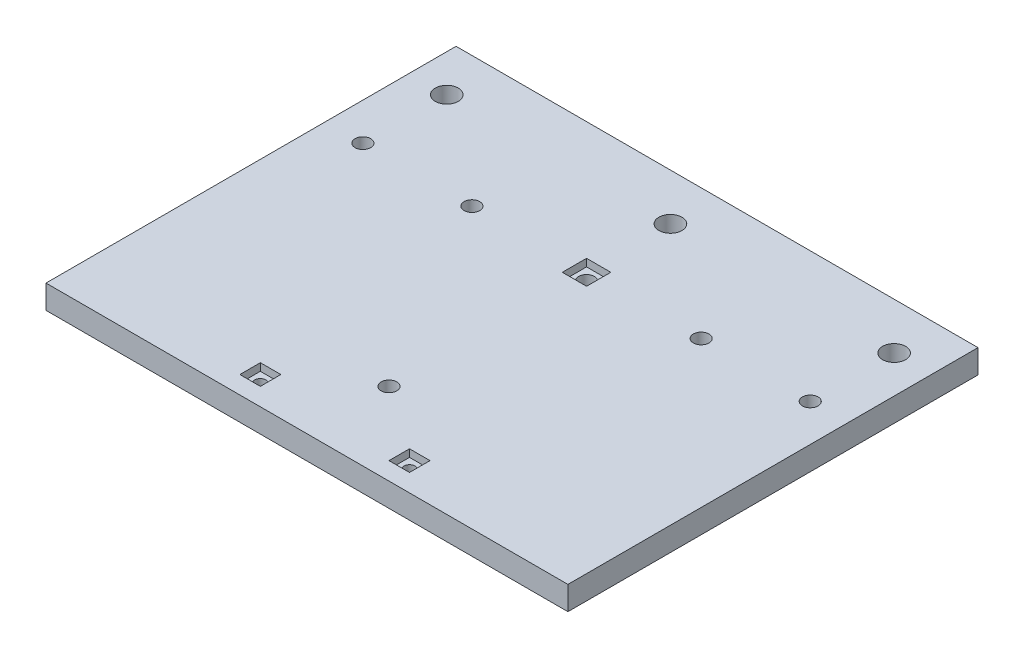
ISO-10303-21;
HEADER;
FILE_DESCRIPTION(('STEP AP214'),'2;1');
FILE_NAME('part.step','',(''),(''),'','','');
FILE_SCHEMA(('AUTOMOTIVE_DESIGN { 1 0 10303 214 1 1 1 1 }'));
ENDSEC;
DATA;
#1=APPLICATION_CONTEXT('core data for automotive mechanical design processes');
#2=APPLICATION_PROTOCOL_DEFINITION('international standard','automotive_design',2000,#1);
#3=PRODUCT_CONTEXT('',#1,'mechanical');
#4=PRODUCT('Part','Part','',(#3));
#5=PRODUCT_RELATED_PRODUCT_CATEGORY('part','',(#4));
#6=PRODUCT_DEFINITION_FORMATION('','',#4);
#7=PRODUCT_DEFINITION_CONTEXT('part definition',#1,'design');
#8=PRODUCT_DEFINITION('design','',#6,#7);
#9=PRODUCT_DEFINITION_SHAPE('','',#8);
#10=(LENGTH_UNIT() NAMED_UNIT(*) SI_UNIT(.MILLI.,.METRE.));
#11=(NAMED_UNIT(*) PLANE_ANGLE_UNIT() SI_UNIT($,.RADIAN.));
#12=(NAMED_UNIT(*) SI_UNIT($,.STERADIAN.) SOLID_ANGLE_UNIT());
#13=UNCERTAINTY_MEASURE_WITH_UNIT(LENGTH_MEASURE(1.E-05),#10,'distance_accuracy_value','');
#14=(GEOMETRIC_REPRESENTATION_CONTEXT(3) GLOBAL_UNCERTAINTY_ASSIGNED_CONTEXT((#13)) GLOBAL_UNIT_ASSIGNED_CONTEXT((#10,
#11,#12)) REPRESENTATION_CONTEXT('',''));
#15=CARTESIAN_POINT('',(0.,0.,0.));
#16=DIRECTION('',(0.,0.,1.));
#17=DIRECTION('',(1.,0.,0.));
#18=AXIS2_PLACEMENT_3D('',#15,#16,#17);
#19=CARTESIAN_POINT('',(0.,6.35,0.));
#20=DIRECTION('',(0.,0.,-1.));
#21=DIRECTION('',(-1.,0.,0.));
#22=AXIS2_PLACEMENT_3D('',#19,#20,#21);
#23=PLANE('',#22);
#24=DIRECTION('',(1.,0.,0.));
#25=VECTOR('',#24,1.);
#26=CARTESIAN_POINT('',(0.,0.,0.));
#27=LINE('',#26,#25);
#28=CARTESIAN_POINT('',(0.,0.,0.));
#29=VERTEX_POINT('',#28);
#30=CARTESIAN_POINT('',(140.,0.,0.));
#31=VERTEX_POINT('',#30);
#32=EDGE_CURVE('E387',#29,#31,#27,.T.);
#33=ORIENTED_EDGE('',*,*,#32,.T.);
#34=DIRECTION('',(0.,-1.,0.));
#35=VECTOR('',#34,1.);
#36=CARTESIAN_POINT('',(140.,6.35,0.));
#37=LINE('',#36,#35);
#38=CARTESIAN_POINT('',(140.,6.35,0.));
#39=VERTEX_POINT('',#38);
#40=EDGE_CURVE('E11',#39,#31,#37,.T.);
#41=ORIENTED_EDGE('',*,*,#40,.F.);
#42=DIRECTION('',(1.,0.,0.));
#43=VECTOR('',#42,1.);
#44=CARTESIAN_POINT('',(0.,6.35,0.));
#45=LINE('',#44,#43);
#46=CARTESIAN_POINT('',(0.,6.35,0.));
#47=VERTEX_POINT('',#46);
#48=EDGE_CURVE('E331',#47,#39,#45,.T.);
#49=ORIENTED_EDGE('',*,*,#48,.F.);
#50=DIRECTION('',(0.,-1.,0.));
#51=VECTOR('',#50,1.);
#52=CARTESIAN_POINT('',(0.,6.35,0.));
#53=LINE('',#52,#51);
#54=EDGE_CURVE('E346',#47,#29,#53,.T.);
#55=ORIENTED_EDGE('',*,*,#54,.T.);
#56=EDGE_LOOP('',(#33,#41,#49,#55));
#57=FACE_BOUND('',#56,.T.);
#58=ADVANCED_FACE('F45',(#57),#23,.F.);
#59=CARTESIAN_POINT('',(140.,6.35,0.));
#60=DIRECTION('',(-1.,0.,0.));
#61=DIRECTION('',(0.,0.,1.));
#62=AXIS2_PLACEMENT_3D('',#59,#60,#61);
#63=PLANE('',#62);
#64=DIRECTION('',(0.,0.,-1.));
#65=VECTOR('',#64,1.);
#66=CARTESIAN_POINT('',(140.,0.,0.));
#67=LINE('',#66,#65);
#68=CARTESIAN_POINT('',(140.,0.,-110.));
#69=VERTEX_POINT('',#68);
#70=EDGE_CURVE('E391',#31,#69,#67,.T.);
#71=ORIENTED_EDGE('',*,*,#70,.T.);
#72=DIRECTION('',(0.,-1.,0.));
#73=VECTOR('',#72,1.);
#74=CARTESIAN_POINT('',(140.,6.35,-110.));
#75=LINE('',#74,#73);
#76=CARTESIAN_POINT('',(140.,6.35,-110.));
#77=VERTEX_POINT('',#76);
#78=EDGE_CURVE('E55',#77,#69,#75,.T.);
#79=ORIENTED_EDGE('',*,*,#78,.F.);
#80=DIRECTION('',(0.,0.,-1.));
#81=VECTOR('',#80,1.);
#82=CARTESIAN_POINT('',(140.,6.35,0.));
#83=LINE('',#82,#81);
#84=EDGE_CURVE('E335',#39,#77,#83,.T.);
#85=ORIENTED_EDGE('',*,*,#84,.F.);
#86=ORIENTED_EDGE('',*,*,#40,.T.);
#87=EDGE_LOOP('',(#71,#79,#85,#86));
#88=FACE_BOUND('',#87,.T.);
#89=ADVANCED_FACE('F475',(#88),#63,.F.);
#90=CARTESIAN_POINT('',(0.,6.35,-110.));
#91=DIRECTION('',(0.,0.,-1.));
#92=DIRECTION('',(-1.,0.,0.));
#93=AXIS2_PLACEMENT_3D('',#90,#91,#92);
#94=PLANE('',#93);
#95=DIRECTION('',(1.,0.,0.));
#96=VECTOR('',#95,1.);
#97=CARTESIAN_POINT('',(0.,0.,-110.));
#98=LINE('',#97,#96);
#99=CARTESIAN_POINT('',(0.,0.,-110.));
#100=VERTEX_POINT('',#99);
#101=EDGE_CURVE('E395',#100,#69,#98,.T.);
#102=ORIENTED_EDGE('',*,*,#101,.F.);
#103=DIRECTION('',(0.,-1.,0.));
#104=VECTOR('',#103,1.);
#105=CARTESIAN_POINT('',(0.,6.35,-110.));
#106=LINE('',#105,#104);
#107=CARTESIAN_POINT('',(0.,6.35,-110.));
#108=VERTEX_POINT('',#107);
#109=EDGE_CURVE('E408',#108,#100,#106,.T.);
#110=ORIENTED_EDGE('',*,*,#109,.F.);
#111=DIRECTION('',(1.,0.,0.));
#112=VECTOR('',#111,1.);
#113=CARTESIAN_POINT('',(0.,6.35,-110.));
#114=LINE('',#113,#112);
#115=EDGE_CURVE('E338',#108,#77,#114,.T.);
#116=ORIENTED_EDGE('',*,*,#115,.T.);
#117=ORIENTED_EDGE('',*,*,#78,.T.);
#118=EDGE_LOOP('',(#102,#110,#116,#117));
#119=FACE_BOUND('',#118,.T.);
#120=ADVANCED_FACE('F481',(#119),#94,.T.);
#121=CARTESIAN_POINT('',(0.,6.35,0.));
#122=DIRECTION('',(-1.,0.,0.));
#123=DIRECTION('',(0.,0.,1.));
#124=AXIS2_PLACEMENT_3D('',#121,#122,#123);
#125=PLANE('',#124);
#126=DIRECTION('',(0.,0.,-1.));
#127=VECTOR('',#126,1.);
#128=CARTESIAN_POINT('',(0.,0.,0.));
#129=LINE('',#128,#127);
#130=EDGE_CURVE('E399',#29,#100,#129,.T.);
#131=ORIENTED_EDGE('',*,*,#130,.F.);
#132=ORIENTED_EDGE('',*,*,#54,.F.);
#133=DIRECTION('',(0.,0.,-1.));
#134=VECTOR('',#133,1.);
#135=CARTESIAN_POINT('',(0.,6.35,0.));
#136=LINE('',#135,#134);
#137=EDGE_CURVE('E342',#47,#108,#136,.T.);
#138=ORIENTED_EDGE('',*,*,#137,.T.);
#139=ORIENTED_EDGE('',*,*,#109,.T.);
#140=EDGE_LOOP('',(#131,#132,#138,#139));
#141=FACE_BOUND('',#140,.T.);
#142=ADVANCED_FACE('F490',(#141),#125,.T.);
#143=CARTESIAN_POINT('',(39.25,6.35,-75.));
#144=DIRECTION('',(0.,-1.,0.));
#145=DIRECTION('',(0.,0.,-1.));
#146=AXIS2_PLACEMENT_3D('',#143,#144,#145);
#147=CYLINDRICAL_SURFACE('',#146,2.10000000000001);
#148=CARTESIAN_POINT('',(39.25,6.35,-75.));
#149=DIRECTION('',(0.,1.,0.));
#150=DIRECTION('',(0.,0.,1.));
#151=AXIS2_PLACEMENT_3D('',#148,#149,#150);
#152=CIRCLE('',#151,2.10000000000001);
#153=CARTESIAN_POINT('',(39.25,6.35,-72.9));
#154=VERTEX_POINT('',#153);
#155=EDGE_CURVE('E327',#154,#154,#152,.T.);
#156=ORIENTED_EDGE('',*,*,#155,.T.);
#157=EDGE_LOOP('',(#156));
#158=FACE_BOUND('',#157,.T.);
#159=CARTESIAN_POINT('',(39.25,0.,-75.));
#160=DIRECTION('',(0.,1.,0.));
#161=DIRECTION('',(0.,0.,1.));
#162=AXIS2_PLACEMENT_3D('',#159,#160,#161);
#163=CIRCLE('',#162,2.10000000000001);
#164=CARTESIAN_POINT('',(39.25,0.,-72.9));
#165=VERTEX_POINT('',#164);
#166=EDGE_CURVE('E383',#165,#165,#163,.T.);
#167=ORIENTED_EDGE('',*,*,#166,.F.);
#168=EDGE_LOOP('',(#167));
#169=FACE_BOUND('',#168,.T.);
#170=ADVANCED_FACE('F486',(#158,#169),#147,.F.);
#171=CARTESIAN_POINT('',(100.75,6.35,-75.));
#172=DIRECTION('',(0.,-1.,0.));
#173=DIRECTION('',(0.,0.,-1.));
#174=AXIS2_PLACEMENT_3D('',#171,#172,#173);
#175=CYLINDRICAL_SURFACE('',#174,2.1);
#176=CARTESIAN_POINT('',(100.75,6.35,-75.));
#177=DIRECTION('',(0.,1.,0.));
#178=DIRECTION('',(0.,0.,1.));
#179=AXIS2_PLACEMENT_3D('',#176,#177,#178);
#180=CIRCLE('',#179,2.1);
#181=CARTESIAN_POINT('',(100.75,6.35,-72.9));
#182=VERTEX_POINT('',#181);
#183=EDGE_CURVE('E323',#182,#182,#180,.T.);
#184=ORIENTED_EDGE('',*,*,#183,.T.);
#185=EDGE_LOOP('',(#184));
#186=FACE_BOUND('',#185,.T.);
#187=CARTESIAN_POINT('',(100.75,0.,-75.));
#188=DIRECTION('',(0.,1.,0.));
#189=DIRECTION('',(0.,0.,1.));
#190=AXIS2_PLACEMENT_3D('',#187,#188,#189);
#191=CIRCLE('',#190,2.1);
#192=CARTESIAN_POINT('',(100.75,0.,-72.9));
#193=VERTEX_POINT('',#192);
#194=EDGE_CURVE('E379',#193,#193,#191,.T.);
#195=ORIENTED_EDGE('',*,*,#194,.F.);
#196=EDGE_LOOP('',(#195));
#197=FACE_BOUND('',#196,.T.);
#198=ADVANCED_FACE('F489',(#186,#197),#175,.F.);
#199=CARTESIAN_POINT('',(70.,6.35,-22.));
#200=DIRECTION('',(0.,-1.,0.));
#201=DIRECTION('',(0.,0.,-1.));
#202=AXIS2_PLACEMENT_3D('',#199,#200,#201);
#203=CYLINDRICAL_SURFACE('',#202,2.1);
#204=CARTESIAN_POINT('',(70.,6.35,-22.));
#205=DIRECTION('',(0.,1.,0.));
#206=DIRECTION('',(0.,0.,1.));
#207=AXIS2_PLACEMENT_3D('',#204,#205,#206);
#208=CIRCLE('',#207,2.1);
#209=CARTESIAN_POINT('',(70.,6.35,-19.9));
#210=VERTEX_POINT('',#209);
#211=EDGE_CURVE('E319',#210,#210,#208,.T.);
#212=ORIENTED_EDGE('',*,*,#211,.T.);
#213=EDGE_LOOP('',(#212));
#214=FACE_BOUND('',#213,.T.);
#215=CARTESIAN_POINT('',(70.,0.,-22.));
#216=DIRECTION('',(0.,1.,0.));
#217=DIRECTION('',(0.,0.,1.));
#218=AXIS2_PLACEMENT_3D('',#215,#216,#217);
#219=CIRCLE('',#218,2.1);
#220=CARTESIAN_POINT('',(70.,0.,-19.9));
#221=VERTEX_POINT('',#220);
#222=EDGE_CURVE('E375',#221,#221,#219,.T.);
#223=ORIENTED_EDGE('',*,*,#222,.F.);
#224=EDGE_LOOP('',(#223));
#225=FACE_BOUND('',#224,.T.);
#226=ADVANCED_FACE('F494',(#214,#225),#203,.F.);
#227=CARTESIAN_POINT('',(10.,6.35,-97.5));
#228=DIRECTION('',(0.,-1.,0.));
#229=DIRECTION('',(0.,0.,-1.));
#230=AXIS2_PLACEMENT_3D('',#227,#228,#229);
#231=CYLINDRICAL_SURFACE('',#230,3.1);
#232=CARTESIAN_POINT('',(10.,6.35,-97.5));
#233=DIRECTION('',(0.,1.,0.));
#234=DIRECTION('',(0.,0.,1.));
#235=AXIS2_PLACEMENT_3D('',#232,#233,#234);
#236=CIRCLE('',#235,3.1);
#237=CARTESIAN_POINT('',(10.,6.35,-94.4));
#238=VERTEX_POINT('',#237);
#239=EDGE_CURVE('E315',#238,#238,#236,.T.);
#240=ORIENTED_EDGE('',*,*,#239,.T.);
#241=EDGE_LOOP('',(#240));
#242=FACE_BOUND('',#241,.T.);
#243=CARTESIAN_POINT('',(10.,0.,-97.5));
#244=DIRECTION('',(0.,1.,0.));
#245=DIRECTION('',(0.,0.,1.));
#246=AXIS2_PLACEMENT_3D('',#243,#244,#245);
#247=CIRCLE('',#246,3.1);
#248=CARTESIAN_POINT('',(10.,0.,-94.4));
#249=VERTEX_POINT('',#248);
#250=EDGE_CURVE('E371',#249,#249,#247,.T.);
#251=ORIENTED_EDGE('',*,*,#250,.F.);
#252=EDGE_LOOP('',(#251));
#253=FACE_BOUND('',#252,.T.);
#254=ADVANCED_FACE('F498',(#242,#253),#231,.F.);
#255=CARTESIAN_POINT('',(70.,6.35,-97.5));
#256=DIRECTION('',(0.,-1.,0.));
#257=DIRECTION('',(0.,0.,-1.));
#258=AXIS2_PLACEMENT_3D('',#255,#256,#257);
#259=CYLINDRICAL_SURFACE('',#258,3.09999999999999);
#260=CARTESIAN_POINT('',(70.,6.35,-97.5));
#261=DIRECTION('',(0.,1.,0.));
#262=DIRECTION('',(0.,0.,1.));
#263=AXIS2_PLACEMENT_3D('',#260,#261,#262);
#264=CIRCLE('',#263,3.09999999999999);
#265=CARTESIAN_POINT('',(70.,6.35,-94.4));
#266=VERTEX_POINT('',#265);
#267=EDGE_CURVE('E311',#266,#266,#264,.T.);
#268=ORIENTED_EDGE('',*,*,#267,.T.);
#269=EDGE_LOOP('',(#268));
#270=FACE_BOUND('',#269,.T.);
#271=CARTESIAN_POINT('',(70.,0.,-97.5));
#272=DIRECTION('',(0.,1.,0.));
#273=DIRECTION('',(0.,0.,1.));
#274=AXIS2_PLACEMENT_3D('',#271,#272,#273);
#275=CIRCLE('',#274,3.09999999999999);
#276=CARTESIAN_POINT('',(70.,0.,-94.4));
#277=VERTEX_POINT('',#276);
#278=EDGE_CURVE('E367',#277,#277,#275,.T.);
#279=ORIENTED_EDGE('',*,*,#278,.F.);
#280=EDGE_LOOP('',(#279));
#281=FACE_BOUND('',#280,.T.);
#282=ADVANCED_FACE('F502',(#270,#281),#259,.F.);
#283=CARTESIAN_POINT('',(130.,6.35,-97.5));
#284=DIRECTION('',(0.,-1.,0.));
#285=DIRECTION('',(0.,0.,-1.));
#286=AXIS2_PLACEMENT_3D('',#283,#284,#285);
#287=CYLINDRICAL_SURFACE('',#286,3.09999999999999);
#288=CARTESIAN_POINT('',(130.,6.35,-97.5));
#289=DIRECTION('',(0.,1.,0.));
#290=DIRECTION('',(0.,0.,1.));
#291=AXIS2_PLACEMENT_3D('',#288,#289,#290);
#292=CIRCLE('',#291,3.09999999999999);
#293=CARTESIAN_POINT('',(130.,6.35,-94.4));
#294=VERTEX_POINT('',#293);
#295=EDGE_CURVE('E307',#294,#294,#292,.T.);
#296=ORIENTED_EDGE('',*,*,#295,.T.);
#297=EDGE_LOOP('',(#296));
#298=FACE_BOUND('',#297,.T.);
#299=CARTESIAN_POINT('',(130.,0.,-97.5));
#300=DIRECTION('',(0.,1.,0.));
#301=DIRECTION('',(0.,0.,1.));
#302=AXIS2_PLACEMENT_3D('',#299,#300,#301);
#303=CIRCLE('',#302,3.09999999999999);
#304=CARTESIAN_POINT('',(130.,0.,-94.4));
#305=VERTEX_POINT('',#304);
#306=EDGE_CURVE('E363',#305,#305,#303,.T.);
#307=ORIENTED_EDGE('',*,*,#306,.F.);
#308=EDGE_LOOP('',(#307));
#309=FACE_BOUND('',#308,.T.);
#310=ADVANCED_FACE('F506',(#298,#309),#287,.F.);
#311=CARTESIAN_POINT('',(10.,6.35,-75.));
#312=DIRECTION('',(0.,-1.,0.));
#313=DIRECTION('',(0.,0.,-1.));
#314=AXIS2_PLACEMENT_3D('',#311,#312,#313);
#315=CYLINDRICAL_SURFACE('',#314,2.1);
#316=CARTESIAN_POINT('',(10.,6.35,-75.));
#317=DIRECTION('',(0.,1.,0.));
#318=DIRECTION('',(0.,0.,1.));
#319=AXIS2_PLACEMENT_3D('',#316,#317,#318);
#320=CIRCLE('',#319,2.1);
#321=CARTESIAN_POINT('',(10.,6.35,-72.9));
#322=VERTEX_POINT('',#321);
#323=EDGE_CURVE('E302',#322,#322,#320,.T.);
#324=ORIENTED_EDGE('',*,*,#323,.T.);
#325=EDGE_LOOP('',(#324));
#326=FACE_BOUND('',#325,.T.);
#327=CARTESIAN_POINT('',(10.,0.,-75.));
#328=DIRECTION('',(0.,1.,0.));
#329=DIRECTION('',(0.,0.,1.));
#330=AXIS2_PLACEMENT_3D('',#327,#328,#329);
#331=CIRCLE('',#330,2.1);
#332=CARTESIAN_POINT('',(10.,0.,-72.9));
#333=VERTEX_POINT('',#332);
#334=EDGE_CURVE('E359',#333,#333,#331,.T.);
#335=ORIENTED_EDGE('',*,*,#334,.F.);
#336=EDGE_LOOP('',(#335));
#337=FACE_BOUND('',#336,.T.);
#338=ADVANCED_FACE('F510',(#326,#337),#315,.F.);
#339=CARTESIAN_POINT('',(130.,6.35,-75.));
#340=DIRECTION('',(0.,-1.,0.));
#341=DIRECTION('',(0.,0.,-1.));
#342=AXIS2_PLACEMENT_3D('',#339,#340,#341);
#343=CYLINDRICAL_SURFACE('',#342,2.10000000000002);
#344=CARTESIAN_POINT('',(130.,6.35,-75.));
#345=DIRECTION('',(0.,1.,0.));
#346=DIRECTION('',(0.,0.,1.));
#347=AXIS2_PLACEMENT_3D('',#344,#345,#346);
#348=CIRCLE('',#347,2.10000000000002);
#349=CARTESIAN_POINT('',(130.,6.35,-72.9));
#350=VERTEX_POINT('',#349);
#351=EDGE_CURVE('E298',#350,#350,#348,.T.);
#352=ORIENTED_EDGE('',*,*,#351,.T.);
#353=EDGE_LOOP('',(#352));
#354=FACE_BOUND('',#353,.T.);
#355=CARTESIAN_POINT('',(130.,0.,-75.));
#356=DIRECTION('',(0.,1.,0.));
#357=DIRECTION('',(0.,0.,1.));
#358=AXIS2_PLACEMENT_3D('',#355,#356,#357);
#359=CIRCLE('',#358,2.10000000000002);
#360=CARTESIAN_POINT('',(130.,0.,-72.9));
#361=VERTEX_POINT('',#360);
#362=EDGE_CURVE('E355',#361,#361,#359,.T.);
#363=ORIENTED_EDGE('',*,*,#362,.F.);
#364=EDGE_LOOP('',(#363));
#365=FACE_BOUND('',#364,.T.);
#366=ADVANCED_FACE('F430',(#354,#365),#343,.F.);
#367=CARTESIAN_POINT('',(50.,6.35,-7.5));
#368=DIRECTION('',(0.,-1.,0.));
#369=DIRECTION('',(0.,0.,-1.));
#370=AXIS2_PLACEMENT_3D('',#367,#368,#369);
#371=CYLINDRICAL_SURFACE('',#370,1.5);
#372=CARTESIAN_POINT('',(50.,4.35,-7.5));
#373=DIRECTION('',(0.,-1.,0.));
#374=DIRECTION('',(0.,0.,-1.));
#375=AXIS2_PLACEMENT_3D('',#372,#373,#374);
#376=CIRCLE('',#375,1.5);
#377=CARTESIAN_POINT('',(50.,4.35,-9.00000000000001));
#378=VERTEX_POINT('',#377);
#379=EDGE_CURVE('E49',#378,#378,#376,.T.);
#380=ORIENTED_EDGE('',*,*,#379,.F.);
#381=EDGE_LOOP('',(#380));
#382=FACE_BOUND('',#381,.T.);
#383=CARTESIAN_POINT('',(50.,0.,-7.5));
#384=DIRECTION('',(0.,1.,0.));
#385=DIRECTION('',(0.,0.,1.));
#386=AXIS2_PLACEMENT_3D('',#383,#384,#385);
#387=CIRCLE('',#386,1.5);
#388=CARTESIAN_POINT('',(50.,0.,-6.));
#389=VERTEX_POINT('',#388);
#390=EDGE_CURVE('E351',#389,#389,#387,.T.);
#391=ORIENTED_EDGE('',*,*,#390,.F.);
#392=EDGE_LOOP('',(#391));
#393=FACE_BOUND('',#392,.T.);
#394=ADVANCED_FACE('F427',(#382,#393),#371,.F.);
#395=CARTESIAN_POINT('',(90.,6.35,-7.5));
#396=DIRECTION('',(0.,-1.,0.));
#397=DIRECTION('',(0.,0.,-1.));
#398=AXIS2_PLACEMENT_3D('',#395,#396,#397);
#399=CYLINDRICAL_SURFACE('',#398,1.5);
#400=CARTESIAN_POINT('',(90.,4.35,-7.5));
#401=DIRECTION('',(0.,-1.,0.));
#402=DIRECTION('',(0.,0.,-1.));
#403=AXIS2_PLACEMENT_3D('',#400,#401,#402);
#404=CIRCLE('',#403,1.5);
#405=CARTESIAN_POINT('',(90.,4.35,-9.));
#406=VERTEX_POINT('',#405);
#407=EDGE_CURVE('E415',#406,#406,#404,.T.);
#408=ORIENTED_EDGE('',*,*,#407,.F.);
#409=EDGE_LOOP('',(#408));
#410=FACE_BOUND('',#409,.T.);
#411=CARTESIAN_POINT('',(90.,0.,-7.5));
#412=DIRECTION('',(0.,1.,0.));
#413=DIRECTION('',(0.,0.,1.));
#414=AXIS2_PLACEMENT_3D('',#411,#412,#413);
#415=CIRCLE('',#414,1.5);
#416=CARTESIAN_POINT('',(90.,0.,-6.));
#417=VERTEX_POINT('',#416);
#418=EDGE_CURVE('E347',#417,#417,#415,.T.);
#419=ORIENTED_EDGE('',*,*,#418,.F.);
#420=EDGE_LOOP('',(#419));
#421=FACE_BOUND('',#420,.T.);
#422=ADVANCED_FACE('F47',(#410,#421),#399,.F.);
#423=CARTESIAN_POINT('',(70.,6.35,-75.));
#424=DIRECTION('',(0.,-1.,0.));
#425=DIRECTION('',(0.,0.,-1.));
#426=AXIS2_PLACEMENT_3D('',#423,#424,#425);
#427=CYLINDRICAL_SURFACE('',#426,2.1);
#428=CARTESIAN_POINT('',(70.,4.35,-75.));
#429=DIRECTION('',(0.,-1.,0.));
#430=DIRECTION('',(0.,0.,-1.));
#431=AXIS2_PLACEMENT_3D('',#428,#429,#430);
#432=CIRCLE('',#431,2.1);
#433=CARTESIAN_POINT('',(70.,4.35,-77.1));
#434=VERTEX_POINT('',#433);
#435=EDGE_CURVE('E206',#434,#434,#432,.T.);
#436=ORIENTED_EDGE('',*,*,#435,.F.);
#437=EDGE_LOOP('',(#436));
#438=FACE_BOUND('',#437,.T.);
#439=CARTESIAN_POINT('',(70.,0.,-75.));
#440=DIRECTION('',(0.,1.,0.));
#441=DIRECTION('',(0.,0.,1.));
#442=AXIS2_PLACEMENT_3D('',#439,#440,#441);
#443=CIRCLE('',#442,2.1);
#444=CARTESIAN_POINT('',(70.,0.,-72.9));
#445=VERTEX_POINT('',#444);
#446=EDGE_CURVE('E303',#445,#445,#443,.T.);
#447=ORIENTED_EDGE('',*,*,#446,.F.);
#448=EDGE_LOOP('',(#447));
#449=FACE_BOUND('',#448,.T.);
#450=ADVANCED_FACE('F461',(#438,#449),#427,.F.);
#451=CARTESIAN_POINT('',(0.,6.35,0.));
#452=DIRECTION('',(0.,1.,0.));
#453=DIRECTION('',(0.,0.,1.));
#454=AXIS2_PLACEMENT_3D('',#451,#452,#453);
#455=PLANE('',#454);
#456=DIRECTION('',(0.,0.,-1.));
#457=VECTOR('',#456,1.);
#458=CARTESIAN_POINT('',(73.25,6.35,-71.75));
#459=LINE('',#458,#457);
#460=CARTESIAN_POINT('',(73.25,6.35,-71.75));
#461=VERTEX_POINT('',#460);
#462=CARTESIAN_POINT('',(73.25,6.35,-78.25));
#463=VERTEX_POINT('',#462);
#464=EDGE_CURVE('E63',#461,#463,#459,.T.);
#465=ORIENTED_EDGE('',*,*,#464,.F.);
#466=DIRECTION('',(1.,0.,0.));
#467=VECTOR('',#466,1.);
#468=CARTESIAN_POINT('',(66.75,6.35,-71.75));
#469=LINE('',#468,#467);
#470=CARTESIAN_POINT('',(66.75,6.35,-71.75));
#471=VERTEX_POINT('',#470);
#472=EDGE_CURVE('E184',#471,#461,#469,.T.);
#473=ORIENTED_EDGE('',*,*,#472,.F.);
#474=DIRECTION('',(0.,0.,1.));
#475=VECTOR('',#474,1.);
#476=CARTESIAN_POINT('',(66.75,6.35,-71.75));
#477=LINE('',#476,#475);
#478=CARTESIAN_POINT('',(66.75,6.35,-78.25));
#479=VERTEX_POINT('',#478);
#480=EDGE_CURVE('E188',#479,#471,#477,.T.);
#481=ORIENTED_EDGE('',*,*,#480,.F.);
#482=DIRECTION('',(-1.,0.,0.));
#483=VECTOR('',#482,1.);
#484=CARTESIAN_POINT('',(66.75,6.35,-78.25));
#485=LINE('',#484,#483);
#486=EDGE_CURVE('E197',#463,#479,#485,.T.);
#487=ORIENTED_EDGE('',*,*,#486,.F.);
#488=EDGE_LOOP('',(#465,#473,#481,#487));
#489=FACE_BOUND('',#488,.T.);
#490=DIRECTION('',(0.,0.,-1.));
#491=VECTOR('',#490,1.);
#492=CARTESIAN_POINT('',(52.75,6.35,-4.75));
#493=LINE('',#492,#491);
#494=CARTESIAN_POINT('',(52.75,6.35,-4.75));
#495=VERTEX_POINT('',#494);
#496=CARTESIAN_POINT('',(52.75,6.35,-10.25));
#497=VERTEX_POINT('',#496);
#498=EDGE_CURVE('E71',#495,#497,#493,.T.);
#499=ORIENTED_EDGE('',*,*,#498,.F.);
#500=DIRECTION('',(1.,0.,0.));
#501=VECTOR('',#500,1.);
#502=CARTESIAN_POINT('',(47.25,6.35,-4.75));
#503=LINE('',#502,#501);
#504=CARTESIAN_POINT('',(47.25,6.35,-4.75));
#505=VERTEX_POINT('',#504);
#506=EDGE_CURVE('E226',#505,#495,#503,.T.);
#507=ORIENTED_EDGE('',*,*,#506,.F.);
#508=DIRECTION('',(0.,0.,1.));
#509=VECTOR('',#508,1.);
#510=CARTESIAN_POINT('',(47.25,6.35,-4.75));
#511=LINE('',#510,#509);
#512=CARTESIAN_POINT('',(47.25,6.35,-10.25));
#513=VERTEX_POINT('',#512);
#514=EDGE_CURVE('E230',#513,#505,#511,.T.);
#515=ORIENTED_EDGE('',*,*,#514,.F.);
#516=DIRECTION('',(-1.,0.,0.));
#517=VECTOR('',#516,1.);
#518=CARTESIAN_POINT('',(47.25,6.35,-10.25));
#519=LINE('',#518,#517);
#520=EDGE_CURVE('E235',#497,#513,#519,.T.);
#521=ORIENTED_EDGE('',*,*,#520,.F.);
#522=EDGE_LOOP('',(#499,#507,#515,#521));
#523=FACE_BOUND('',#522,.T.);
#524=DIRECTION('',(0.,0.,-1.));
#525=VECTOR('',#524,1.);
#526=CARTESIAN_POINT('',(92.75,6.35,-4.75));
#527=LINE('',#526,#525);
#528=CARTESIAN_POINT('',(92.75,6.35,-4.75));
#529=VERTEX_POINT('',#528);
#530=CARTESIAN_POINT('',(92.75,6.35,-10.25));
#531=VERTEX_POINT('',#530);
#532=EDGE_CURVE('E225',#529,#531,#527,.T.);
#533=ORIENTED_EDGE('',*,*,#532,.F.);
#534=DIRECTION('',(1.,0.,0.));
#535=VECTOR('',#534,1.);
#536=CARTESIAN_POINT('',(87.25,6.35,-4.75));
#537=LINE('',#536,#535);
#538=CARTESIAN_POINT('',(87.25,6.35,-4.75));
#539=VERTEX_POINT('',#538);
#540=EDGE_CURVE('E269',#539,#529,#537,.T.);
#541=ORIENTED_EDGE('',*,*,#540,.F.);
#542=DIRECTION('',(0.,0.,1.));
#543=VECTOR('',#542,1.);
#544=CARTESIAN_POINT('',(87.25,6.35,-4.75));
#545=LINE('',#544,#543);
#546=CARTESIAN_POINT('',(87.25,6.35,-10.25));
#547=VERTEX_POINT('',#546);
#548=EDGE_CURVE('E273',#547,#539,#545,.T.);
#549=ORIENTED_EDGE('',*,*,#548,.F.);
#550=DIRECTION('',(-1.,0.,0.));
#551=VECTOR('',#550,1.);
#552=CARTESIAN_POINT('',(87.25,6.35,-10.25));
#553=LINE('',#552,#551);
#554=EDGE_CURVE('E278',#531,#547,#553,.T.);
#555=ORIENTED_EDGE('',*,*,#554,.F.);
#556=EDGE_LOOP('',(#533,#541,#549,#555));
#557=FACE_BOUND('',#556,.T.);
#558=ORIENTED_EDGE('',*,*,#351,.F.);
#559=EDGE_LOOP('',(#558));
#560=FACE_BOUND('',#559,.T.);
#561=ORIENTED_EDGE('',*,*,#323,.F.);
#562=EDGE_LOOP('',(#561));
#563=FACE_BOUND('',#562,.T.);
#564=ORIENTED_EDGE('',*,*,#295,.F.);
#565=EDGE_LOOP('',(#564));
#566=FACE_BOUND('',#565,.T.);
#567=ORIENTED_EDGE('',*,*,#267,.F.);
#568=EDGE_LOOP('',(#567));
#569=FACE_BOUND('',#568,.T.);
#570=ORIENTED_EDGE('',*,*,#239,.F.);
#571=EDGE_LOOP('',(#570));
#572=FACE_BOUND('',#571,.T.);
#573=ORIENTED_EDGE('',*,*,#211,.F.);
#574=EDGE_LOOP('',(#573));
#575=FACE_BOUND('',#574,.T.);
#576=ORIENTED_EDGE('',*,*,#183,.F.);
#577=EDGE_LOOP('',(#576));
#578=FACE_BOUND('',#577,.T.);
#579=ORIENTED_EDGE('',*,*,#155,.F.);
#580=EDGE_LOOP('',(#579));
#581=FACE_BOUND('',#580,.T.);
#582=ORIENTED_EDGE('',*,*,#48,.T.);
#583=ORIENTED_EDGE('',*,*,#84,.T.);
#584=ORIENTED_EDGE('',*,*,#115,.F.);
#585=ORIENTED_EDGE('',*,*,#137,.F.);
#586=EDGE_LOOP('',(#582,#583,#584,#585));
#587=FACE_BOUND('',#586,.T.);
#588=ADVANCED_FACE('F437',(#489,#523,#557,#560,#563,#566,#569,#572,#575,#578,#581,#587),#455,.T.);
#589=CARTESIAN_POINT('',(0.,0.,0.));
#590=DIRECTION('',(0.,1.,0.));
#591=DIRECTION('',(0.,0.,1.));
#592=AXIS2_PLACEMENT_3D('',#589,#590,#591);
#593=PLANE('',#592);
#594=ORIENTED_EDGE('',*,*,#418,.T.);
#595=EDGE_LOOP('',(#594));
#596=FACE_BOUND('',#595,.T.);
#597=ORIENTED_EDGE('',*,*,#390,.T.);
#598=EDGE_LOOP('',(#597));
#599=FACE_BOUND('',#598,.T.);
#600=ORIENTED_EDGE('',*,*,#362,.T.);
#601=EDGE_LOOP('',(#600));
#602=FACE_BOUND('',#601,.T.);
#603=ORIENTED_EDGE('',*,*,#334,.T.);
#604=EDGE_LOOP('',(#603));
#605=FACE_BOUND('',#604,.T.);
#606=ORIENTED_EDGE('',*,*,#306,.T.);
#607=EDGE_LOOP('',(#606));
#608=FACE_BOUND('',#607,.T.);
#609=ORIENTED_EDGE('',*,*,#278,.T.);
#610=EDGE_LOOP('',(#609));
#611=FACE_BOUND('',#610,.T.);
#612=ORIENTED_EDGE('',*,*,#250,.T.);
#613=EDGE_LOOP('',(#612));
#614=FACE_BOUND('',#613,.T.);
#615=ORIENTED_EDGE('',*,*,#222,.T.);
#616=EDGE_LOOP('',(#615));
#617=FACE_BOUND('',#616,.T.);
#618=ORIENTED_EDGE('',*,*,#194,.T.);
#619=EDGE_LOOP('',(#618));
#620=FACE_BOUND('',#619,.T.);
#621=ORIENTED_EDGE('',*,*,#166,.T.);
#622=EDGE_LOOP('',(#621));
#623=FACE_BOUND('',#622,.T.);
#624=ORIENTED_EDGE('',*,*,#32,.F.);
#625=ORIENTED_EDGE('',*,*,#130,.T.);
#626=ORIENTED_EDGE('',*,*,#101,.T.);
#627=ORIENTED_EDGE('',*,*,#70,.F.);
#628=EDGE_LOOP('',(#624,#625,#626,#627));
#629=FACE_BOUND('',#628,.T.);
#630=ORIENTED_EDGE('',*,*,#446,.T.);
#631=EDGE_LOOP('',(#630));
#632=FACE_BOUND('',#631,.T.);
#633=ADVANCED_FACE('F433',(#596,#599,#602,#605,#608,#611,#614,#617,#620,#623,#629,#632),#593,.F.);
#634=CARTESIAN_POINT('',(92.75,4.35,-4.75));
#635=DIRECTION('',(1.,0.,0.));
#636=DIRECTION('',(0.,0.,-1.));
#637=AXIS2_PLACEMENT_3D('',#634,#635,#636);
#638=PLANE('',#637);
#639=ORIENTED_EDGE('',*,*,#532,.T.);
#640=DIRECTION('',(0.,1.,0.));
#641=VECTOR('',#640,1.);
#642=CARTESIAN_POINT('',(92.75,4.35,-10.25));
#643=LINE('',#642,#641);
#644=CARTESIAN_POINT('',(92.75,4.35,-10.25));
#645=VERTEX_POINT('',#644);
#646=EDGE_CURVE('E255',#645,#531,#643,.T.);
#647=ORIENTED_EDGE('',*,*,#646,.F.);
#648=DIRECTION('',(0.,0.,-1.));
#649=VECTOR('',#648,1.);
#650=CARTESIAN_POINT('',(92.75,4.35,-4.75));
#651=LINE('',#650,#649);
#652=CARTESIAN_POINT('',(92.75,4.35,-4.75));
#653=VERTEX_POINT('',#652);
#654=EDGE_CURVE('E274',#653,#645,#651,.T.);
#655=ORIENTED_EDGE('',*,*,#654,.F.);
#656=DIRECTION('',(0.,1.,0.));
#657=VECTOR('',#656,1.);
#658=CARTESIAN_POINT('',(92.75,4.35,-4.75));
#659=LINE('',#658,#657);
#660=EDGE_CURVE('E266',#653,#529,#659,.T.);
#661=ORIENTED_EDGE('',*,*,#660,.T.);
#662=EDGE_LOOP('',(#639,#647,#655,#661));
#663=FACE_BOUND('',#662,.T.);
#664=ADVANCED_FACE('F436',(#663),#638,.F.);
#665=CARTESIAN_POINT('',(87.25,4.35,-4.75));
#666=DIRECTION('',(0.,0.,1.));
#667=DIRECTION('',(1.,0.,0.));
#668=AXIS2_PLACEMENT_3D('',#665,#666,#667);
#669=PLANE('',#668);
#670=ORIENTED_EDGE('',*,*,#540,.T.);
#671=ORIENTED_EDGE('',*,*,#660,.F.);
#672=DIRECTION('',(1.,0.,0.));
#673=VECTOR('',#672,1.);
#674=CARTESIAN_POINT('',(87.25,4.35,-4.75));
#675=LINE('',#674,#673);
#676=CARTESIAN_POINT('',(87.25,4.35,-4.75));
#677=VERTEX_POINT('',#676);
#678=EDGE_CURVE('E259',#677,#653,#675,.T.);
#679=ORIENTED_EDGE('',*,*,#678,.F.);
#680=DIRECTION('',(0.,1.,0.));
#681=VECTOR('',#680,1.);
#682=CARTESIAN_POINT('',(87.25,4.35,-4.75));
#683=LINE('',#682,#681);
#684=EDGE_CURVE('E263',#677,#539,#683,.T.);
#685=ORIENTED_EDGE('',*,*,#684,.T.);
#686=EDGE_LOOP('',(#670,#671,#679,#685));
#687=FACE_BOUND('',#686,.T.);
#688=ADVANCED_FACE('F657',(#687),#669,.F.);
#689=CARTESIAN_POINT('',(87.25,4.35,-4.75));
#690=DIRECTION('',(-1.,0.,0.));
#691=DIRECTION('',(0.,0.,1.));
#692=AXIS2_PLACEMENT_3D('',#689,#690,#691);
#693=PLANE('',#692);
#694=ORIENTED_EDGE('',*,*,#548,.T.);
#695=ORIENTED_EDGE('',*,*,#684,.F.);
#696=DIRECTION('',(0.,0.,1.));
#697=VECTOR('',#696,1.);
#698=CARTESIAN_POINT('',(87.25,4.35,-4.75));
#699=LINE('',#698,#697);
#700=CARTESIAN_POINT('',(87.25,4.35,-10.25));
#701=VERTEX_POINT('',#700);
#702=EDGE_CURVE('E287',#701,#677,#699,.T.);
#703=ORIENTED_EDGE('',*,*,#702,.F.);
#704=DIRECTION('',(0.,1.,0.));
#705=VECTOR('',#704,1.);
#706=CARTESIAN_POINT('',(87.25,4.35,-10.25));
#707=LINE('',#706,#705);
#708=EDGE_CURVE('E260',#701,#547,#707,.T.);
#709=ORIENTED_EDGE('',*,*,#708,.T.);
#710=EDGE_LOOP('',(#694,#695,#703,#709));
#711=FACE_BOUND('',#710,.T.);
#712=ADVANCED_FACE('F667',(#711),#693,.F.);
#713=CARTESIAN_POINT('',(87.25,4.35,-10.25));
#714=DIRECTION('',(0.,0.,-1.));
#715=DIRECTION('',(-1.,0.,0.));
#716=AXIS2_PLACEMENT_3D('',#713,#714,#715);
#717=PLANE('',#716);
#718=ORIENTED_EDGE('',*,*,#554,.T.);
#719=ORIENTED_EDGE('',*,*,#708,.F.);
#720=DIRECTION('',(-1.,0.,0.));
#721=VECTOR('',#720,1.);
#722=CARTESIAN_POINT('',(87.25,4.35,-10.25));
#723=LINE('',#722,#721);
#724=EDGE_CURVE('E291',#645,#701,#723,.T.);
#725=ORIENTED_EDGE('',*,*,#724,.F.);
#726=ORIENTED_EDGE('',*,*,#646,.T.);
#727=EDGE_LOOP('',(#718,#719,#725,#726));
#728=FACE_BOUND('',#727,.T.);
#729=ADVANCED_FACE('F677',(#728),#717,.F.);
#730=CARTESIAN_POINT('',(0.,4.35,0.));
#731=DIRECTION('',(0.,-1.,0.));
#732=DIRECTION('',(0.,0.,-1.));
#733=AXIS2_PLACEMENT_3D('',#730,#731,#732);
#734=PLANE('',#733);
#735=ORIENTED_EDGE('',*,*,#407,.T.);
#736=EDGE_LOOP('',(#735));
#737=FACE_BOUND('',#736,.T.);
#738=ORIENTED_EDGE('',*,*,#654,.T.);
#739=ORIENTED_EDGE('',*,*,#724,.T.);
#740=ORIENTED_EDGE('',*,*,#702,.T.);
#741=ORIENTED_EDGE('',*,*,#678,.T.);
#742=EDGE_LOOP('',(#738,#739,#740,#741));
#743=FACE_BOUND('',#742,.T.);
#744=ADVANCED_FACE('F687',(#737,#743),#734,.F.);
#745=CARTESIAN_POINT('',(52.75,4.35,-4.75));
#746=DIRECTION('',(1.,0.,0.));
#747=DIRECTION('',(0.,0.,-1.));
#748=AXIS2_PLACEMENT_3D('',#745,#746,#747);
#749=PLANE('',#748);
#750=ORIENTED_EDGE('',*,*,#498,.T.);
#751=DIRECTION('',(0.,1.,0.));
#752=VECTOR('',#751,1.);
#753=CARTESIAN_POINT('',(52.75,4.35,-10.25));
#754=LINE('',#753,#752);
#755=CARTESIAN_POINT('',(52.75,4.35,-10.25));
#756=VERTEX_POINT('',#755);
#757=EDGE_CURVE('E212',#756,#497,#754,.T.);
#758=ORIENTED_EDGE('',*,*,#757,.F.);
#759=DIRECTION('',(0.,0.,-1.));
#760=VECTOR('',#759,1.);
#761=CARTESIAN_POINT('',(52.75,4.35,-4.75));
#762=LINE('',#761,#760);
#763=CARTESIAN_POINT('',(52.75,4.35,-4.75));
#764=VERTEX_POINT('',#763);
#765=EDGE_CURVE('E231',#764,#756,#762,.T.);
#766=ORIENTED_EDGE('',*,*,#765,.F.);
#767=DIRECTION('',(0.,1.,0.));
#768=VECTOR('',#767,1.);
#769=CARTESIAN_POINT('',(52.75,4.35,-4.75));
#770=LINE('',#769,#768);
#771=EDGE_CURVE('E222',#764,#495,#770,.T.);
#772=ORIENTED_EDGE('',*,*,#771,.T.);
#773=EDGE_LOOP('',(#750,#758,#766,#772));
#774=FACE_BOUND('',#773,.T.);
#775=ADVANCED_FACE('F697',(#774),#749,.F.);
#776=CARTESIAN_POINT('',(47.25,4.35,-4.75));
#777=DIRECTION('',(0.,0.,1.));
#778=DIRECTION('',(1.,0.,0.));
#779=AXIS2_PLACEMENT_3D('',#776,#777,#778);
#780=PLANE('',#779);
#781=ORIENTED_EDGE('',*,*,#506,.T.);
#782=ORIENTED_EDGE('',*,*,#771,.F.);
#783=DIRECTION('',(1.,0.,0.));
#784=VECTOR('',#783,1.);
#785=CARTESIAN_POINT('',(47.25,4.35,-4.75));
#786=LINE('',#785,#784);
#787=CARTESIAN_POINT('',(47.25,4.35,-4.75));
#788=VERTEX_POINT('',#787);
#789=EDGE_CURVE('E215',#788,#764,#786,.T.);
#790=ORIENTED_EDGE('',*,*,#789,.F.);
#791=DIRECTION('',(0.,1.,0.));
#792=VECTOR('',#791,1.);
#793=CARTESIAN_POINT('',(47.25,4.35,-4.75));
#794=LINE('',#793,#792);
#795=EDGE_CURVE('E219',#788,#505,#794,.T.);
#796=ORIENTED_EDGE('',*,*,#795,.T.);
#797=EDGE_LOOP('',(#781,#782,#790,#796));
#798=FACE_BOUND('',#797,.T.);
#799=ADVANCED_FACE('F706',(#798),#780,.F.);
#800=CARTESIAN_POINT('',(47.25,4.35,-4.75));
#801=DIRECTION('',(-1.,0.,0.));
#802=DIRECTION('',(0.,0.,1.));
#803=AXIS2_PLACEMENT_3D('',#800,#801,#802);
#804=PLANE('',#803);
#805=ORIENTED_EDGE('',*,*,#514,.T.);
#806=ORIENTED_EDGE('',*,*,#795,.F.);
#807=DIRECTION('',(0.,0.,1.));
#808=VECTOR('',#807,1.);
#809=CARTESIAN_POINT('',(47.25,4.35,-4.75));
#810=LINE('',#809,#808);
#811=CARTESIAN_POINT('',(47.25,4.35,-10.25));
#812=VERTEX_POINT('',#811);
#813=EDGE_CURVE('E244',#812,#788,#810,.T.);
#814=ORIENTED_EDGE('',*,*,#813,.F.);
#815=DIRECTION('',(0.,1.,0.));
#816=VECTOR('',#815,1.);
#817=CARTESIAN_POINT('',(47.25,4.35,-10.25));
#818=LINE('',#817,#816);
#819=EDGE_CURVE('E216',#812,#513,#818,.T.);
#820=ORIENTED_EDGE('',*,*,#819,.T.);
#821=EDGE_LOOP('',(#805,#806,#814,#820));
#822=FACE_BOUND('',#821,.T.);
#823=ADVANCED_FACE('F715',(#822),#804,.F.);
#824=CARTESIAN_POINT('',(47.25,4.35,-10.25));
#825=DIRECTION('',(0.,0.,-1.));
#826=DIRECTION('',(-1.,0.,0.));
#827=AXIS2_PLACEMENT_3D('',#824,#825,#826);
#828=PLANE('',#827);
#829=ORIENTED_EDGE('',*,*,#520,.T.);
#830=ORIENTED_EDGE('',*,*,#819,.F.);
#831=DIRECTION('',(-1.,0.,0.));
#832=VECTOR('',#831,1.);
#833=CARTESIAN_POINT('',(47.25,4.35,-10.25));
#834=LINE('',#833,#832);
#835=EDGE_CURVE('E248',#756,#812,#834,.T.);
#836=ORIENTED_EDGE('',*,*,#835,.F.);
#837=ORIENTED_EDGE('',*,*,#757,.T.);
#838=EDGE_LOOP('',(#829,#830,#836,#837));
#839=FACE_BOUND('',#838,.T.);
#840=ADVANCED_FACE('F725',(#839),#828,.F.);
#841=CARTESIAN_POINT('',(0.,4.35,0.));
#842=DIRECTION('',(0.,-1.,0.));
#843=DIRECTION('',(0.,0.,-1.));
#844=AXIS2_PLACEMENT_3D('',#841,#842,#843);
#845=PLANE('',#844);
#846=ORIENTED_EDGE('',*,*,#379,.T.);
#847=EDGE_LOOP('',(#846));
#848=FACE_BOUND('',#847,.T.);
#849=ORIENTED_EDGE('',*,*,#765,.T.);
#850=ORIENTED_EDGE('',*,*,#835,.T.);
#851=ORIENTED_EDGE('',*,*,#813,.T.);
#852=ORIENTED_EDGE('',*,*,#789,.T.);
#853=EDGE_LOOP('',(#849,#850,#851,#852));
#854=FACE_BOUND('',#853,.T.);
#855=ADVANCED_FACE('F424',(#848,#854),#845,.F.);
#856=CARTESIAN_POINT('',(73.25,4.35,-71.75));
#857=DIRECTION('',(1.,0.,0.));
#858=DIRECTION('',(0.,0.,-1.));
#859=AXIS2_PLACEMENT_3D('',#856,#857,#858);
#860=PLANE('',#859);
#861=ORIENTED_EDGE('',*,*,#464,.T.);
#862=DIRECTION('',(0.,1.,0.));
#863=VECTOR('',#862,1.);
#864=CARTESIAN_POINT('',(73.25,4.35,-78.25));
#865=LINE('',#864,#863);
#866=CARTESIAN_POINT('',(73.25,4.35,-78.25));
#867=VERTEX_POINT('',#866);
#868=EDGE_CURVE('E159',#867,#463,#865,.T.);
#869=ORIENTED_EDGE('',*,*,#868,.F.);
#870=DIRECTION('',(0.,0.,-1.));
#871=VECTOR('',#870,1.);
#872=CARTESIAN_POINT('',(73.25,4.35,-71.75));
#873=LINE('',#872,#871);
#874=CARTESIAN_POINT('',(73.25,4.35,-71.75));
#875=VERTEX_POINT('',#874);
#876=EDGE_CURVE('E163',#875,#867,#873,.T.);
#877=ORIENTED_EDGE('',*,*,#876,.F.);
#878=DIRECTION('',(0.,1.,0.));
#879=VECTOR('',#878,1.);
#880=CARTESIAN_POINT('',(73.25,4.35,-71.75));
#881=LINE('',#880,#879);
#882=EDGE_CURVE('E203',#875,#461,#881,.T.);
#883=ORIENTED_EDGE('',*,*,#882,.T.);
#884=EDGE_LOOP('',(#861,#869,#877,#883));
#885=FACE_BOUND('',#884,.T.);
#886=ADVANCED_FACE('F161',(#885),#860,.F.);
#887=CARTESIAN_POINT('',(66.75,4.35,-71.75));
#888=DIRECTION('',(0.,0.,1.));
#889=DIRECTION('',(1.,0.,0.));
#890=AXIS2_PLACEMENT_3D('',#887,#888,#889);
#891=PLANE('',#890);
#892=ORIENTED_EDGE('',*,*,#472,.T.);
#893=ORIENTED_EDGE('',*,*,#882,.F.);
#894=DIRECTION('',(1.,0.,0.));
#895=VECTOR('',#894,1.);
#896=CARTESIAN_POINT('',(66.75,4.35,-71.75));
#897=LINE('',#896,#895);
#898=CARTESIAN_POINT('',(66.75,4.35,-71.75));
#899=VERTEX_POINT('',#898);
#900=EDGE_CURVE('E170',#899,#875,#897,.T.);
#901=ORIENTED_EDGE('',*,*,#900,.F.);
#902=DIRECTION('',(0.,1.,0.));
#903=VECTOR('',#902,1.);
#904=CARTESIAN_POINT('',(66.75,4.35,-71.75));
#905=LINE('',#904,#903);
#906=EDGE_CURVE('E207',#899,#471,#905,.T.);
#907=ORIENTED_EDGE('',*,*,#906,.T.);
#908=EDGE_LOOP('',(#892,#893,#901,#907));
#909=FACE_BOUND('',#908,.T.);
#910=ADVANCED_FACE('F752',(#909),#891,.F.);
#911=CARTESIAN_POINT('',(66.75,4.35,-71.75));
#912=DIRECTION('',(-1.,0.,0.));
#913=DIRECTION('',(0.,0.,1.));
#914=AXIS2_PLACEMENT_3D('',#911,#912,#913);
#915=PLANE('',#914);
#916=ORIENTED_EDGE('',*,*,#480,.T.);
#917=ORIENTED_EDGE('',*,*,#906,.F.);
#918=DIRECTION('',(0.,0.,1.));
#919=VECTOR('',#918,1.);
#920=CARTESIAN_POINT('',(66.75,4.35,-71.75));
#921=LINE('',#920,#919);
#922=CARTESIAN_POINT('',(66.75,4.35,-78.25));
#923=VERTEX_POINT('',#922);
#924=EDGE_CURVE('E179',#923,#899,#921,.T.);
#925=ORIENTED_EDGE('',*,*,#924,.F.);
#926=DIRECTION('',(0.,1.,0.));
#927=VECTOR('',#926,1.);
#928=CARTESIAN_POINT('',(66.75,4.35,-78.25));
#929=LINE('',#928,#927);
#930=EDGE_CURVE('E169',#923,#479,#929,.T.);
#931=ORIENTED_EDGE('',*,*,#930,.T.);
#932=EDGE_LOOP('',(#916,#917,#925,#931));
#933=FACE_BOUND('',#932,.T.);
#934=ADVANCED_FACE('F761',(#933),#915,.F.);
#935=CARTESIAN_POINT('',(66.75,4.35,-78.25));
#936=DIRECTION('',(0.,0.,-1.));
#937=DIRECTION('',(-1.,0.,0.));
#938=AXIS2_PLACEMENT_3D('',#935,#936,#937);
#939=PLANE('',#938);
#940=ORIENTED_EDGE('',*,*,#486,.T.);
#941=ORIENTED_EDGE('',*,*,#930,.F.);
#942=DIRECTION('',(-1.,0.,0.));
#943=VECTOR('',#942,1.);
#944=CARTESIAN_POINT('',(66.75,4.35,-78.25));
#945=LINE('',#944,#943);
#946=EDGE_CURVE('E173',#867,#923,#945,.T.);
#947=ORIENTED_EDGE('',*,*,#946,.F.);
#948=ORIENTED_EDGE('',*,*,#868,.T.);
#949=EDGE_LOOP('',(#940,#941,#947,#948));
#950=FACE_BOUND('',#949,.T.);
#951=ADVANCED_FACE('F174',(#950),#939,.F.);
#952=CARTESIAN_POINT('',(0.,4.35,0.));
#953=DIRECTION('',(0.,-1.,0.));
#954=DIRECTION('',(0.,0.,-1.));
#955=AXIS2_PLACEMENT_3D('',#952,#953,#954);
#956=PLANE('',#955);
#957=ORIENTED_EDGE('',*,*,#435,.T.);
#958=EDGE_LOOP('',(#957));
#959=FACE_BOUND('',#958,.T.);
#960=ORIENTED_EDGE('',*,*,#876,.T.);
#961=ORIENTED_EDGE('',*,*,#946,.T.);
#962=ORIENTED_EDGE('',*,*,#924,.T.);
#963=ORIENTED_EDGE('',*,*,#900,.T.);
#964=EDGE_LOOP('',(#960,#961,#962,#963));
#965=FACE_BOUND('',#964,.T.);
#966=ADVANCED_FACE('F181',(#959,#965),#956,.F.);
#967=CLOSED_SHELL('',(#58,#89,#120,#142,#170,#198,#226,#254,#282,#310,#338,#366,#394,#422,#450,
#588,#633,#664,#688,#712,#729,#744,#775,#799,#823,#840,#855,#886,#910,#934,#951,#966));
#968=MANIFOLD_SOLID_BREP('B2',#967);
#969=ADVANCED_BREP_SHAPE_REPRESENTATION('',(#18,#968),#14);
#970=SHAPE_DEFINITION_REPRESENTATION(#9,#969);
ENDSEC;
END-ISO-10303-21;
